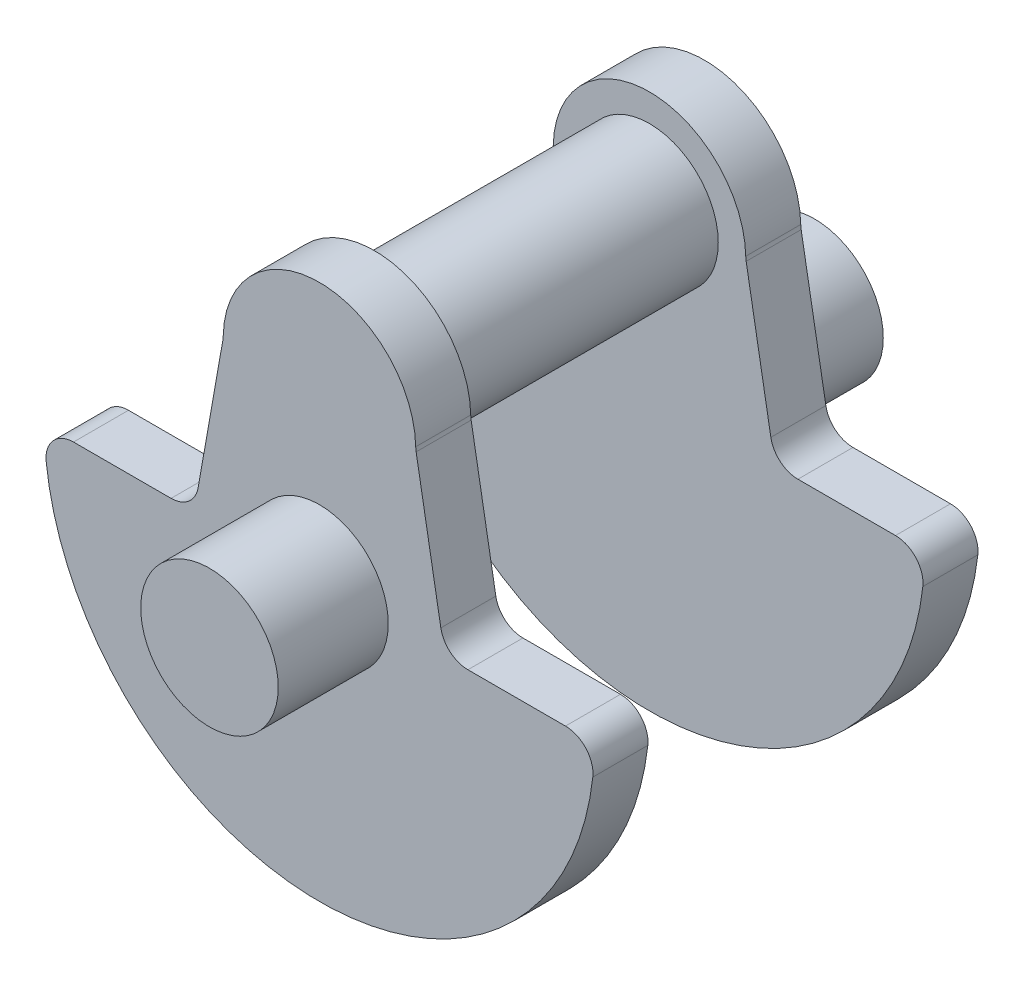
ISO-10303-21;
HEADER;
FILE_DESCRIPTION(('STEP AP214'),'2;1');
FILE_NAME('part.step','',(''),(''),'','','');
FILE_SCHEMA(('AUTOMOTIVE_DESIGN { 1 0 10303 214 1 1 1 1 }'));
ENDSEC;
DATA;
#1=APPLICATION_CONTEXT('core data for automotive mechanical design processes');
#2=APPLICATION_PROTOCOL_DEFINITION('international standard','automotive_design',2000,#1);
#3=PRODUCT_CONTEXT('',#1,'mechanical');
#4=PRODUCT('Part','Part','',(#3));
#5=PRODUCT_RELATED_PRODUCT_CATEGORY('part','',(#4));
#6=PRODUCT_DEFINITION_FORMATION('','',#4);
#7=PRODUCT_DEFINITION_CONTEXT('part definition',#1,'design');
#8=PRODUCT_DEFINITION('design','',#6,#7);
#9=PRODUCT_DEFINITION_SHAPE('','',#8);
#10=(LENGTH_UNIT() NAMED_UNIT(*) SI_UNIT(.MILLI.,.METRE.));
#11=(NAMED_UNIT(*) PLANE_ANGLE_UNIT() SI_UNIT($,.RADIAN.));
#12=(NAMED_UNIT(*) SI_UNIT($,.STERADIAN.) SOLID_ANGLE_UNIT());
#13=UNCERTAINTY_MEASURE_WITH_UNIT(LENGTH_MEASURE(1.E-05),#10,'distance_accuracy_value','');
#14=(GEOMETRIC_REPRESENTATION_CONTEXT(3) GLOBAL_UNCERTAINTY_ASSIGNED_CONTEXT((#13)) GLOBAL_UNIT_ASSIGNED_CONTEXT((#10,
#11,#12)) REPRESENTATION_CONTEXT('',''));
#15=CARTESIAN_POINT('',(0.,0.,0.));
#16=DIRECTION('',(0.,0.,1.));
#17=DIRECTION('',(1.,0.,0.));
#18=AXIS2_PLACEMENT_3D('',#15,#16,#17);
#19=CARTESIAN_POINT('',(0.,0.,-10.));
#20=DIRECTION('',(0.,0.,1.));
#21=DIRECTION('',(1.,0.,0.));
#22=AXIS2_PLACEMENT_3D('',#19,#20,#21);
#23=CYLINDRICAL_SURFACE('',#22,50.);
#24=CARTESIAN_POINT('',(0.,0.,-10.));
#25=DIRECTION('',(0.,0.,1.));
#26=DIRECTION('',(1.,0.,0.));
#27=AXIS2_PLACEMENT_3D('',#24,#25,#26);
#28=CIRCLE('',#27,50.);
#29=CARTESIAN_POINT('',(49.6903994999953,-5.55555555555556,-10.));
#30=VERTEX_POINT('',#29);
#31=CARTESIAN_POINT('',(-49.6903994999953,-5.55555555555556,-10.));
#32=VERTEX_POINT('',#31);
#33=EDGE_CURVE('E224',#30,#32,#28,.F.);
#34=ORIENTED_EDGE('',*,*,#33,.F.);
#35=DIRECTION('',(0.,0.,1.));
#36=VECTOR('',#35,1.);
#37=CARTESIAN_POINT('',(49.6903994999953,-5.55555555555556,-10.));
#38=LINE('',#37,#36);
#39=CARTESIAN_POINT('',(49.6903994999953,-5.55555555555556,0.));
#40=VERTEX_POINT('',#39);
#41=EDGE_CURVE('E208',#30,#40,#38,.T.);
#42=ORIENTED_EDGE('',*,*,#41,.T.);
#43=CARTESIAN_POINT('',(0.,0.,0.));
#44=DIRECTION('',(0.,0.,1.));
#45=DIRECTION('',(1.,0.,0.));
#46=AXIS2_PLACEMENT_3D('',#43,#44,#45);
#47=CIRCLE('',#46,50.);
#48=CARTESIAN_POINT('',(-49.6903994999953,-5.55555555555556,0.));
#49=VERTEX_POINT('',#48);
#50=EDGE_CURVE('E221',#40,#49,#47,.F.);
#51=ORIENTED_EDGE('',*,*,#50,.T.);
#52=DIRECTION('',(0.,0.,1.));
#53=VECTOR('',#52,1.);
#54=CARTESIAN_POINT('',(-49.6903994999953,-5.55555555555556,-10.));
#55=LINE('',#54,#53);
#56=EDGE_CURVE('E226',#49,#32,#55,.F.);
#57=ORIENTED_EDGE('',*,*,#56,.T.);
#58=EDGE_LOOP('',(#34,#42,#51,#57));
#59=FACE_BOUND('',#58,.T.);
#60=ADVANCED_FACE('F41',(#59),#23,.T.);
#61=CARTESIAN_POINT('',(0.,0.,-10.));
#62=DIRECTION('',(0.,1.,0.));
#63=DIRECTION('',(-1.,0.,0.));
#64=AXIS2_PLACEMENT_3D('',#61,#62,#63);
#65=PLANE('',#64);
#66=DIRECTION('',(-1.,0.,0.));
#67=VECTOR('',#66,1.);
#68=CARTESIAN_POINT('',(0.,0.,0.));
#69=LINE('',#68,#67);
#70=CARTESIAN_POINT('',(-26.98530757714,0.,0.));
#71=VERTEX_POINT('',#70);
#72=CARTESIAN_POINT('',(-44.7213595499958,0.,0.));
#73=VERTEX_POINT('',#72);
#74=EDGE_CURVE('E256',#71,#73,#69,.T.);
#75=ORIENTED_EDGE('',*,*,#74,.F.);
#76=DIRECTION('',(0.,0.,1.));
#77=VECTOR('',#76,1.);
#78=CARTESIAN_POINT('',(-26.98530757714,0.,-10.));
#79=LINE('',#78,#77);
#80=CARTESIAN_POINT('',(-26.98530757714,0.,-10.));
#81=VERTEX_POINT('',#80);
#82=EDGE_CURVE('E299',#71,#81,#79,.F.);
#83=ORIENTED_EDGE('',*,*,#82,.T.);
#84=DIRECTION('',(-1.,0.,0.));
#85=VECTOR('',#84,1.);
#86=CARTESIAN_POINT('',(0.,0.,-10.));
#87=LINE('',#86,#85);
#88=CARTESIAN_POINT('',(-44.7213595499958,0.,-10.));
#89=VERTEX_POINT('',#88);
#90=EDGE_CURVE('E242',#81,#89,#87,.T.);
#91=ORIENTED_EDGE('',*,*,#90,.T.);
#92=DIRECTION('',(0.,0.,-1.));
#93=VECTOR('',#92,1.);
#94=CARTESIAN_POINT('',(-44.7213595499958,0.,0.));
#95=LINE('',#94,#93);
#96=EDGE_CURVE('E295',#89,#73,#95,.F.);
#97=ORIENTED_EDGE('',*,*,#96,.T.);
#98=EDGE_LOOP('',(#75,#83,#91,#97));
#99=FACE_BOUND('',#98,.T.);
#100=ADVANCED_FACE('F494',(#99),#65,.T.);
#101=CARTESIAN_POINT('',(-22.1026125817614,3.89728694231062,-10.));
#102=DIRECTION('',(-0.98480775301221,0.173648177666917,0.));
#103=DIRECTION('',(-0.173648177666917,-0.98480775301221,0.));
#104=AXIS2_PLACEMENT_3D('',#101,#102,#103);
#105=PLANE('',#104);
#106=DIRECTION('',(-0.173648177666917,-0.98480775301221,0.));
#107=VECTOR('',#106,1.);
#108=CARTESIAN_POINT('',(-22.1026125817614,3.89728694231062,0.));
#109=LINE('',#108,#107);
#110=CARTESIAN_POINT('',(-17.5711628200528,29.5964155924017,0.));
#111=VERTEX_POINT('',#110);
#112=CARTESIAN_POINT('',(-22.0612688120789,4.13175911166541,0.));
#113=VERTEX_POINT('',#112);
#114=EDGE_CURVE('E252',#111,#113,#109,.T.);
#115=ORIENTED_EDGE('',*,*,#114,.F.);
#116=DIRECTION('',(0.,0.,-1.));
#117=VECTOR('',#116,1.);
#118=CARTESIAN_POINT('',(-17.5711628200528,29.5964155924017,-10.));
#119=LINE('',#118,#117);
#120=CARTESIAN_POINT('',(-17.5711628200528,29.5964155924017,-10.));
#121=VERTEX_POINT('',#120);
#122=EDGE_CURVE('E292',#111,#121,#119,.T.);
#123=ORIENTED_EDGE('',*,*,#122,.T.);
#124=DIRECTION('',(-0.173648177666917,-0.98480775301221,0.));
#125=VECTOR('',#124,1.);
#126=CARTESIAN_POINT('',(-22.1026125817614,3.89728694231062,-10.));
#127=LINE('',#126,#125);
#128=CARTESIAN_POINT('',(-22.0612688120789,4.13175911166541,-10.));
#129=VERTEX_POINT('',#128);
#130=EDGE_CURVE('E411',#121,#129,#127,.T.);
#131=ORIENTED_EDGE('',*,*,#130,.T.);
#132=DIRECTION('',(0.,0.,1.));
#133=VECTOR('',#132,1.);
#134=CARTESIAN_POINT('',(-22.0612688120789,4.13175911166541,0.));
#135=LINE('',#134,#133);
#136=EDGE_CURVE('E288',#129,#113,#135,.T.);
#137=ORIENTED_EDGE('',*,*,#136,.T.);
#138=EDGE_LOOP('',(#115,#123,#131,#137));
#139=FACE_BOUND('',#138,.T.);
#140=ADVANCED_FACE('F499',(#139),#105,.T.);
#141=CARTESIAN_POINT('',(0.,30.,-10.));
#142=DIRECTION('',(0.,0.,1.));
#143=DIRECTION('',(1.,0.,0.));
#144=AXIS2_PLACEMENT_3D('',#141,#142,#143);
#145=CYLINDRICAL_SURFACE('',#144,17.5);
#146=CARTESIAN_POINT('',(0.,30.,0.));
#147=DIRECTION('',(0.,0.,1.));
#148=DIRECTION('',(1.,0.,0.));
#149=AXIS2_PLACEMENT_3D('',#146,#147,#148);
#150=CIRCLE('',#149,17.5);
#151=CARTESIAN_POINT('',(17.496267899533,30.3613994850171,0.));
#152=VERTEX_POINT('',#151);
#153=CARTESIAN_POINT('',(-17.496267899533,30.3613994850171,0.));
#154=VERTEX_POINT('',#153);
#155=EDGE_CURVE('E248',#152,#154,#150,.T.);
#156=ORIENTED_EDGE('',*,*,#155,.F.);
#157=DIRECTION('',(0.,0.,1.));
#158=VECTOR('',#157,1.);
#159=CARTESIAN_POINT('',(17.496267899533,30.3613994850171,-10.));
#160=LINE('',#159,#158);
#161=CARTESIAN_POINT('',(17.496267899533,30.3613994850171,-10.));
#162=VERTEX_POINT('',#161);
#163=EDGE_CURVE('E285',#152,#162,#160,.F.);
#164=ORIENTED_EDGE('',*,*,#163,.T.);
#165=CARTESIAN_POINT('',(0.,30.,-10.));
#166=DIRECTION('',(0.,0.,1.));
#167=DIRECTION('',(1.,0.,0.));
#168=AXIS2_PLACEMENT_3D('',#165,#166,#167);
#169=CIRCLE('',#168,17.5);
#170=CARTESIAN_POINT('',(-17.496267899533,30.3613994850171,-10.));
#171=VERTEX_POINT('',#170);
#172=EDGE_CURVE('E414',#162,#171,#169,.T.);
#173=ORIENTED_EDGE('',*,*,#172,.T.);
#174=DIRECTION('',(0.,0.,1.));
#175=VECTOR('',#174,1.);
#176=CARTESIAN_POINT('',(-17.496267899533,30.3613994850171,-10.));
#177=LINE('',#176,#175);
#178=EDGE_CURVE('E281',#171,#154,#177,.T.);
#179=ORIENTED_EDGE('',*,*,#178,.T.);
#180=EDGE_LOOP('',(#156,#164,#173,#179));
#181=FACE_BOUND('',#180,.T.);
#182=ADVANCED_FACE('F624',(#181),#145,.T.);
#183=CARTESIAN_POINT('',(22.1026125817614,3.89728694231062,-10.));
#184=DIRECTION('',(-0.98480775301221,-0.173648177666917,0.));
#185=DIRECTION('',(0.173648177666917,-0.98480775301221,0.));
#186=AXIS2_PLACEMENT_3D('',#183,#184,#185);
#187=PLANE('',#186);
#188=DIRECTION('',(0.173648177666917,-0.98480775301221,0.));
#189=VECTOR('',#188,1.);
#190=CARTESIAN_POINT('',(22.1026125817614,3.89728694231062,0.));
#191=LINE('',#190,#189);
#192=CARTESIAN_POINT('',(17.5711628200528,29.5964155924017,0.));
#193=VERTEX_POINT('',#192);
#194=CARTESIAN_POINT('',(22.0612688120789,4.13175911166541,0.));
#195=VERTEX_POINT('',#194);
#196=EDGE_CURVE('E236',#193,#195,#191,.T.);
#197=ORIENTED_EDGE('',*,*,#196,.T.);
#198=DIRECTION('',(0.,0.,1.));
#199=VECTOR('',#198,1.);
#200=CARTESIAN_POINT('',(22.0612688120789,4.13175911166541,-10.));
#201=LINE('',#200,#199);
#202=CARTESIAN_POINT('',(22.0612688120789,4.13175911166541,-10.));
#203=VERTEX_POINT('',#202);
#204=EDGE_CURVE('E278',#195,#203,#201,.F.);
#205=ORIENTED_EDGE('',*,*,#204,.T.);
#206=DIRECTION('',(0.173648177666917,-0.98480775301221,0.));
#207=VECTOR('',#206,1.);
#208=CARTESIAN_POINT('',(22.1026125817614,3.89728694231062,-10.));
#209=LINE('',#208,#207);
#210=CARTESIAN_POINT('',(17.5711628200528,29.5964155924017,-10.));
#211=VERTEX_POINT('',#210);
#212=EDGE_CURVE('E417',#211,#203,#209,.T.);
#213=ORIENTED_EDGE('',*,*,#212,.F.);
#214=DIRECTION('',(0.,0.,1.));
#215=VECTOR('',#214,1.);
#216=CARTESIAN_POINT('',(17.5711628200528,29.5964155924017,-10.));
#217=LINE('',#216,#215);
#218=EDGE_CURVE('E274',#211,#193,#217,.T.);
#219=ORIENTED_EDGE('',*,*,#218,.T.);
#220=EDGE_LOOP('',(#197,#205,#213,#219));
#221=FACE_BOUND('',#220,.T.);
#222=ADVANCED_FACE('F627',(#221),#187,.F.);
#223=CARTESIAN_POINT('',(0.,0.,-10.));
#224=DIRECTION('',(0.,-1.,0.));
#225=DIRECTION('',(1.,0.,0.));
#226=AXIS2_PLACEMENT_3D('',#223,#224,#225);
#227=PLANE('',#226);
#228=DIRECTION('',(1.,0.,0.));
#229=VECTOR('',#228,1.);
#230=CARTESIAN_POINT('',(0.,0.,0.));
#231=LINE('',#230,#229);
#232=CARTESIAN_POINT('',(26.98530757714,0.,0.));
#233=VERTEX_POINT('',#232);
#234=CARTESIAN_POINT('',(44.7213595499958,0.,0.));
#235=VERTEX_POINT('',#234);
#236=EDGE_CURVE('E231',#233,#235,#231,.T.);
#237=ORIENTED_EDGE('',*,*,#236,.T.);
#238=DIRECTION('',(0.,0.,1.));
#239=VECTOR('',#238,1.);
#240=CARTESIAN_POINT('',(44.7213595499958,0.,-10.));
#241=LINE('',#240,#239);
#242=CARTESIAN_POINT('',(44.7213595499958,0.,-10.));
#243=VERTEX_POINT('',#242);
#244=EDGE_CURVE('E209',#235,#243,#241,.F.);
#245=ORIENTED_EDGE('',*,*,#244,.T.);
#246=DIRECTION('',(1.,0.,0.));
#247=VECTOR('',#246,1.);
#248=CARTESIAN_POINT('',(0.,0.,-10.));
#249=LINE('',#248,#247);
#250=CARTESIAN_POINT('',(26.98530757714,0.,-10.));
#251=VERTEX_POINT('',#250);
#252=EDGE_CURVE('E421',#251,#243,#249,.T.);
#253=ORIENTED_EDGE('',*,*,#252,.F.);
#254=DIRECTION('',(0.,0.,1.));
#255=VECTOR('',#254,1.);
#256=CARTESIAN_POINT('',(26.98530757714,0.,0.));
#257=LINE('',#256,#255);
#258=EDGE_CURVE('E215',#251,#233,#257,.T.);
#259=ORIENTED_EDGE('',*,*,#258,.T.);
#260=EDGE_LOOP('',(#237,#245,#253,#259));
#261=FACE_BOUND('',#260,.T.);
#262=ADVANCED_FACE('F504',(#261),#227,.F.);
#263=CARTESIAN_POINT('',(0.,0.,-10.));
#264=DIRECTION('',(0.,0.,1.));
#265=DIRECTION('',(1.,0.,0.));
#266=AXIS2_PLACEMENT_3D('',#263,#264,#265);
#267=PLANE('',#266);
#268=CARTESIAN_POINT('',(0.,30.,-10.));
#269=DIRECTION('',(0.,0.,1.));
#270=DIRECTION('',(1.,0.,0.));
#271=AXIS2_PLACEMENT_3D('',#268,#269,#270);
#272=CIRCLE('',#271,12.5);
#273=CARTESIAN_POINT('',(12.5,30.,-10.));
#274=VERTEX_POINT('',#273);
#275=EDGE_CURVE('E327',#274,#274,#272,.F.);
#276=ORIENTED_EDGE('',*,*,#275,.F.);
#277=EDGE_LOOP('',(#276));
#278=FACE_BOUND('',#277,.T.);
#279=ORIENTED_EDGE('',*,*,#252,.T.);
#280=CARTESIAN_POINT('',(44.7213595499958,-5.00000000000001,-10.));
#281=DIRECTION('',(0.,0.,1.));
#282=DIRECTION('',(1.,0.,0.));
#283=AXIS2_PLACEMENT_3D('',#280,#281,#282);
#284=CIRCLE('',#283,5.);
#285=EDGE_CURVE('E271',#243,#30,#284,.F.);
#286=ORIENTED_EDGE('',*,*,#285,.T.);
#287=ORIENTED_EDGE('',*,*,#33,.T.);
#288=CARTESIAN_POINT('',(-44.7213595499958,-5.00000000000001,-10.));
#289=DIRECTION('',(0.,0.,1.));
#290=DIRECTION('',(1.,0.,0.));
#291=AXIS2_PLACEMENT_3D('',#288,#289,#290);
#292=CIRCLE('',#291,5.);
#293=EDGE_CURVE('E268',#32,#89,#292,.F.);
#294=ORIENTED_EDGE('',*,*,#293,.T.);
#295=ORIENTED_EDGE('',*,*,#90,.F.);
#296=CARTESIAN_POINT('',(-26.98530757714,5.,-10.));
#297=DIRECTION('',(0.,0.,1.));
#298=DIRECTION('',(1.,0.,0.));
#299=AXIS2_PLACEMENT_3D('',#296,#297,#298);
#300=CIRCLE('',#299,5.);
#301=EDGE_CURVE('E323',#81,#129,#300,.T.);
#302=ORIENTED_EDGE('',*,*,#301,.T.);
#303=ORIENTED_EDGE('',*,*,#130,.F.);
#304=CARTESIAN_POINT('',(-22.4952015851139,30.4646564807363,-10.));
#305=DIRECTION('',(0.,0.,1.));
#306=DIRECTION('',(1.,0.,0.));
#307=AXIS2_PLACEMENT_3D('',#304,#305,#306);
#308=CIRCLE('',#307,5.);
#309=EDGE_CURVE('E317',#121,#171,#308,.T.);
#310=ORIENTED_EDGE('',*,*,#309,.T.);
#311=ORIENTED_EDGE('',*,*,#172,.F.);
#312=CARTESIAN_POINT('',(22.4952015851139,30.4646564807363,-10.));
#313=DIRECTION('',(0.,0.,1.));
#314=DIRECTION('',(1.,0.,0.));
#315=AXIS2_PLACEMENT_3D('',#312,#313,#314);
#316=CIRCLE('',#315,5.);
#317=EDGE_CURVE('E311',#162,#211,#316,.T.);
#318=ORIENTED_EDGE('',*,*,#317,.T.);
#319=ORIENTED_EDGE('',*,*,#212,.T.);
#320=CARTESIAN_POINT('',(26.98530757714,5.,-10.));
#321=DIRECTION('',(0.,0.,1.));
#322=DIRECTION('',(1.,0.,0.));
#323=AXIS2_PLACEMENT_3D('',#320,#321,#322);
#324=CIRCLE('',#323,5.);
#325=EDGE_CURVE('E305',#203,#251,#324,.T.);
#326=ORIENTED_EDGE('',*,*,#325,.T.);
#327=EDGE_LOOP('',(#279,#286,#287,#294,#295,#302,#303,#310,#311,#318,#319,#326));
#328=FACE_BOUND('',#327,.T.);
#329=ADVANCED_FACE('F615',(#278,#328),#267,.F.);
#330=CARTESIAN_POINT('',(0.,0.,0.));
#331=DIRECTION('',(0.,0.,1.));
#332=DIRECTION('',(1.,0.,0.));
#333=AXIS2_PLACEMENT_3D('',#330,#331,#332);
#334=PLANE('',#333);
#335=CARTESIAN_POINT('',(0.,0.,0.));
#336=DIRECTION('',(0.,0.,1.));
#337=DIRECTION('',(1.,0.,0.));
#338=AXIS2_PLACEMENT_3D('',#335,#336,#337);
#339=CIRCLE('',#338,12.5);
#340=CARTESIAN_POINT('',(12.5,0.,0.));
#341=VERTEX_POINT('',#340);
#342=EDGE_CURVE('E326',#341,#341,#339,.T.);
#343=ORIENTED_EDGE('',*,*,#342,.F.);
#344=EDGE_LOOP('',(#343));
#345=FACE_BOUND('',#344,.T.);
#346=ORIENTED_EDGE('',*,*,#50,.F.);
#347=CARTESIAN_POINT('',(44.7213595499958,-5.00000000000001,0.));
#348=DIRECTION('',(0.,0.,1.));
#349=DIRECTION('',(1.,0.,0.));
#350=AXIS2_PLACEMENT_3D('',#347,#348,#349);
#351=CIRCLE('',#350,5.);
#352=EDGE_CURVE('E204',#40,#235,#351,.T.);
#353=ORIENTED_EDGE('',*,*,#352,.T.);
#354=ORIENTED_EDGE('',*,*,#236,.F.);
#355=CARTESIAN_POINT('',(26.98530757714,5.,0.));
#356=DIRECTION('',(0.,0.,1.));
#357=DIRECTION('',(1.,0.,0.));
#358=AXIS2_PLACEMENT_3D('',#355,#356,#357);
#359=CIRCLE('',#358,5.);
#360=EDGE_CURVE('E302',#233,#195,#359,.F.);
#361=ORIENTED_EDGE('',*,*,#360,.T.);
#362=ORIENTED_EDGE('',*,*,#196,.F.);
#363=CARTESIAN_POINT('',(22.4952015851139,30.4646564807363,0.));
#364=DIRECTION('',(0.,0.,1.));
#365=DIRECTION('',(1.,0.,0.));
#366=AXIS2_PLACEMENT_3D('',#363,#364,#365);
#367=CIRCLE('',#366,5.);
#368=EDGE_CURVE('E308',#193,#152,#367,.F.);
#369=ORIENTED_EDGE('',*,*,#368,.T.);
#370=ORIENTED_EDGE('',*,*,#155,.T.);
#371=CARTESIAN_POINT('',(-22.4952015851139,30.4646564807363,0.));
#372=DIRECTION('',(0.,0.,1.));
#373=DIRECTION('',(1.,0.,0.));
#374=AXIS2_PLACEMENT_3D('',#371,#372,#373);
#375=CIRCLE('',#374,5.);
#376=EDGE_CURVE('E314',#154,#111,#375,.F.);
#377=ORIENTED_EDGE('',*,*,#376,.T.);
#378=ORIENTED_EDGE('',*,*,#114,.T.);
#379=CARTESIAN_POINT('',(-26.98530757714,5.,0.));
#380=DIRECTION('',(0.,0.,1.));
#381=DIRECTION('',(1.,0.,0.));
#382=AXIS2_PLACEMENT_3D('',#379,#380,#381);
#383=CIRCLE('',#382,5.);
#384=EDGE_CURVE('E320',#113,#71,#383,.F.);
#385=ORIENTED_EDGE('',*,*,#384,.T.);
#386=ORIENTED_EDGE('',*,*,#74,.T.);
#387=CARTESIAN_POINT('',(-44.7213595499958,-5.00000000000001,0.));
#388=DIRECTION('',(0.,0.,1.));
#389=DIRECTION('',(1.,0.,0.));
#390=AXIS2_PLACEMENT_3D('',#387,#388,#389);
#391=CIRCLE('',#390,5.);
#392=EDGE_CURVE('E216',#73,#49,#391,.T.);
#393=ORIENTED_EDGE('',*,*,#392,.T.);
#394=EDGE_LOOP('',(#346,#353,#354,#361,#362,#369,#370,#377,#378,#385,#386,#393));
#395=FACE_BOUND('',#394,.T.);
#396=ADVANCED_FACE('F228',(#345,#395),#334,.T.);
#397=CARTESIAN_POINT('',(44.7213595499958,-5.00000000000001,-10.));
#398=DIRECTION('',(0.,0.,1.));
#399=DIRECTION('',(1.,0.,0.));
#400=AXIS2_PLACEMENT_3D('',#397,#398,#399);
#401=CYLINDRICAL_SURFACE('',#400,5.);
#402=ORIENTED_EDGE('',*,*,#285,.F.);
#403=ORIENTED_EDGE('',*,*,#244,.F.);
#404=ORIENTED_EDGE('',*,*,#352,.F.);
#405=ORIENTED_EDGE('',*,*,#41,.F.);
#406=EDGE_LOOP('',(#402,#403,#404,#405));
#407=FACE_BOUND('',#406,.T.);
#408=ADVANCED_FACE('F207',(#407),#401,.T.);
#409=CARTESIAN_POINT('',(26.98530757714,5.,-10.));
#410=DIRECTION('',(0.,0.,-1.));
#411=DIRECTION('',(-1.,0.,0.));
#412=AXIS2_PLACEMENT_3D('',#409,#410,#411);
#413=CYLINDRICAL_SURFACE('',#412,5.);
#414=ORIENTED_EDGE('',*,*,#325,.F.);
#415=ORIENTED_EDGE('',*,*,#204,.F.);
#416=ORIENTED_EDGE('',*,*,#360,.F.);
#417=ORIENTED_EDGE('',*,*,#258,.F.);
#418=EDGE_LOOP('',(#414,#415,#416,#417));
#419=FACE_BOUND('',#418,.T.);
#420=ADVANCED_FACE('F508',(#419),#413,.F.);
#421=CARTESIAN_POINT('',(22.4952015851139,30.4646564807363,-10.));
#422=DIRECTION('',(0.,0.,1.));
#423=DIRECTION('',(1.,0.,0.));
#424=AXIS2_PLACEMENT_3D('',#421,#422,#423);
#425=CYLINDRICAL_SURFACE('',#424,5.);
#426=ORIENTED_EDGE('',*,*,#317,.F.);
#427=ORIENTED_EDGE('',*,*,#163,.F.);
#428=ORIENTED_EDGE('',*,*,#368,.F.);
#429=ORIENTED_EDGE('',*,*,#218,.F.);
#430=EDGE_LOOP('',(#426,#427,#428,#429));
#431=FACE_BOUND('',#430,.T.);
#432=ADVANCED_FACE('F511',(#431),#425,.F.);
#433=CARTESIAN_POINT('',(-22.4952015851139,30.4646564807363,-10.));
#434=DIRECTION('',(0.,0.,1.));
#435=DIRECTION('',(1.,0.,0.));
#436=AXIS2_PLACEMENT_3D('',#433,#434,#435);
#437=CYLINDRICAL_SURFACE('',#436,5.);
#438=ORIENTED_EDGE('',*,*,#309,.F.);
#439=ORIENTED_EDGE('',*,*,#122,.F.);
#440=ORIENTED_EDGE('',*,*,#376,.F.);
#441=ORIENTED_EDGE('',*,*,#178,.F.);
#442=EDGE_LOOP('',(#438,#439,#440,#441));
#443=FACE_BOUND('',#442,.T.);
#444=ADVANCED_FACE('F515',(#443),#437,.F.);
#445=CARTESIAN_POINT('',(-26.98530757714,5.,-10.));
#446=DIRECTION('',(0.,0.,-1.));
#447=DIRECTION('',(-1.,0.,0.));
#448=AXIS2_PLACEMENT_3D('',#445,#446,#447);
#449=CYLINDRICAL_SURFACE('',#448,5.);
#450=ORIENTED_EDGE('',*,*,#301,.F.);
#451=ORIENTED_EDGE('',*,*,#82,.F.);
#452=ORIENTED_EDGE('',*,*,#384,.F.);
#453=ORIENTED_EDGE('',*,*,#136,.F.);
#454=EDGE_LOOP('',(#450,#451,#452,#453));
#455=FACE_BOUND('',#454,.T.);
#456=ADVANCED_FACE('F519',(#455),#449,.F.);
#457=CARTESIAN_POINT('',(-44.7213595499958,-5.00000000000001,-10.));
#458=DIRECTION('',(0.,0.,1.));
#459=DIRECTION('',(1.,0.,0.));
#460=AXIS2_PLACEMENT_3D('',#457,#458,#459);
#461=CYLINDRICAL_SURFACE('',#460,5.);
#462=ORIENTED_EDGE('',*,*,#293,.F.);
#463=ORIENTED_EDGE('',*,*,#56,.F.);
#464=ORIENTED_EDGE('',*,*,#392,.F.);
#465=ORIENTED_EDGE('',*,*,#96,.F.);
#466=EDGE_LOOP('',(#462,#463,#464,#465));
#467=FACE_BOUND('',#466,.T.);
#468=ADVANCED_FACE('F523',(#467),#461,.T.);
#469=CARTESIAN_POINT('',(0.,0.,20.));
#470=DIRECTION('',(0.,0.,-1.));
#471=DIRECTION('',(-1.,0.,0.));
#472=AXIS2_PLACEMENT_3D('',#469,#470,#471);
#473=CYLINDRICAL_SURFACE('',#472,12.5);
#474=CARTESIAN_POINT('',(0.,0.,20.));
#475=DIRECTION('',(0.,0.,1.));
#476=DIRECTION('',(1.,0.,0.));
#477=AXIS2_PLACEMENT_3D('',#474,#475,#476);
#478=CIRCLE('',#477,12.5);
#479=CARTESIAN_POINT('',(12.5,0.,20.));
#480=VERTEX_POINT('',#479);
#481=EDGE_CURVE('E232',#480,#480,#478,.T.);
#482=ORIENTED_EDGE('',*,*,#481,.F.);
#483=EDGE_LOOP('',(#482));
#484=FACE_BOUND('',#483,.T.);
#485=ORIENTED_EDGE('',*,*,#342,.T.);
#486=EDGE_LOOP('',(#485));
#487=FACE_BOUND('',#486,.T.);
#488=ADVANCED_FACE('F527',(#484,#487),#473,.T.);
#489=CARTESIAN_POINT('',(0.,0.,20.));
#490=DIRECTION('',(0.,0.,1.));
#491=DIRECTION('',(1.,0.,0.));
#492=AXIS2_PLACEMENT_3D('',#489,#490,#491);
#493=PLANE('',#492);
#494=ORIENTED_EDGE('',*,*,#481,.T.);
#495=EDGE_LOOP('',(#494));
#496=FACE_BOUND('',#495,.T.);
#497=ADVANCED_FACE('F607',(#496),#493,.T.);
#498=CARTESIAN_POINT('',(0.,30.,-60.));
#499=DIRECTION('',(0.,0.,1.));
#500=DIRECTION('',(1.,0.,0.));
#501=AXIS2_PLACEMENT_3D('',#498,#499,#500);
#502=CYLINDRICAL_SURFACE('',#501,12.5);
#503=CARTESIAN_POINT('',(0.,30.,-60.));
#504=DIRECTION('',(0.,0.,-1.));
#505=DIRECTION('',(-1.,0.,0.));
#506=AXIS2_PLACEMENT_3D('',#503,#504,#505);
#507=CIRCLE('',#506,12.5);
#508=CARTESIAN_POINT('',(-12.5,30.,-60.));
#509=VERTEX_POINT('',#508);
#510=EDGE_CURVE('E239',#509,#509,#507,.T.);
#511=ORIENTED_EDGE('',*,*,#510,.F.);
#512=EDGE_LOOP('',(#511));
#513=FACE_BOUND('',#512,.T.);
#514=ORIENTED_EDGE('',*,*,#275,.T.);
#515=EDGE_LOOP('',(#514));
#516=FACE_BOUND('',#515,.T.);
#517=ADVANCED_FACE('F604',(#513,#516),#502,.T.);
#518=CARTESIAN_POINT('',(0.,0.,-60.));
#519=DIRECTION('',(0.,0.,-1.));
#520=DIRECTION('',(-1.,0.,0.));
#521=AXIS2_PLACEMENT_3D('',#518,#519,#520);
#522=CYLINDRICAL_SURFACE('',#521,50.);
#523=CARTESIAN_POINT('',(0.,0.,-70.));
#524=DIRECTION('',(0.,0.,1.));
#525=DIRECTION('',(1.,0.,0.));
#526=AXIS2_PLACEMENT_3D('',#523,#524,#525);
#527=CIRCLE('',#526,50.);
#528=CARTESIAN_POINT('',(49.6903994999953,-5.55555555555556,-70.));
#529=VERTEX_POINT('',#528);
#530=CARTESIAN_POINT('',(-49.6903994999953,-5.55555555555556,-70.));
#531=VERTEX_POINT('',#530);
#532=EDGE_CURVE('E454',#529,#531,#527,.F.);
#533=ORIENTED_EDGE('',*,*,#532,.F.);
#534=DIRECTION('',(0.,0.,-1.));
#535=VECTOR('',#534,1.);
#536=CARTESIAN_POINT('',(49.6903994999953,-5.55555555555556,-60.));
#537=LINE('',#536,#535);
#538=CARTESIAN_POINT('',(49.6903994999953,-5.55555555555556,-60.));
#539=VERTEX_POINT('',#538);
#540=EDGE_CURVE('E348',#529,#539,#537,.F.);
#541=ORIENTED_EDGE('',*,*,#540,.T.);
#542=CARTESIAN_POINT('',(0.,0.,-60.));
#543=DIRECTION('',(0.,0.,1.));
#544=DIRECTION('',(1.,0.,0.));
#545=AXIS2_PLACEMENT_3D('',#542,#543,#544);
#546=CIRCLE('',#545,50.);
#547=CARTESIAN_POINT('',(-49.6903994999953,-5.55555555555556,-60.));
#548=VERTEX_POINT('',#547);
#549=EDGE_CURVE('E438',#539,#548,#546,.F.);
#550=ORIENTED_EDGE('',*,*,#549,.T.);
#551=DIRECTION('',(0.,0.,-1.));
#552=VECTOR('',#551,1.);
#553=CARTESIAN_POINT('',(-49.6903994999953,-5.55555555555556,-60.));
#554=LINE('',#553,#552);
#555=EDGE_CURVE('E344',#548,#531,#554,.T.);
#556=ORIENTED_EDGE('',*,*,#555,.T.);
#557=EDGE_LOOP('',(#533,#541,#550,#556));
#558=FACE_BOUND('',#557,.T.);
#559=ADVANCED_FACE('F562',(#558),#522,.T.);
#560=CARTESIAN_POINT('',(0.,0.,-60.));
#561=DIRECTION('',(0.,1.,0.));
#562=DIRECTION('',(-1.,0.,0.));
#563=AXIS2_PLACEMENT_3D('',#560,#561,#562);
#564=PLANE('',#563);
#565=DIRECTION('',(1.,0.,0.));
#566=VECTOR('',#565,1.);
#567=CARTESIAN_POINT('',(0.,0.,-60.));
#568=LINE('',#567,#566);
#569=CARTESIAN_POINT('',(26.98530757714,0.,-60.));
#570=VERTEX_POINT('',#569);
#571=CARTESIAN_POINT('',(44.7213595499958,0.,-60.));
#572=VERTEX_POINT('',#571);
#573=EDGE_CURVE('E433',#570,#572,#568,.T.);
#574=ORIENTED_EDGE('',*,*,#573,.T.);
#575=DIRECTION('',(0.,0.,-1.));
#576=VECTOR('',#575,1.);
#577=CARTESIAN_POINT('',(44.7213595499958,0.,-60.));
#578=LINE('',#577,#576);
#579=CARTESIAN_POINT('',(44.7213595499958,0.,-70.));
#580=VERTEX_POINT('',#579);
#581=EDGE_CURVE('E334',#572,#580,#578,.T.);
#582=ORIENTED_EDGE('',*,*,#581,.T.);
#583=DIRECTION('',(1.,0.,0.));
#584=VECTOR('',#583,1.);
#585=CARTESIAN_POINT('',(0.,0.,-70.));
#586=LINE('',#585,#584);
#587=CARTESIAN_POINT('',(26.98530757714,0.,-70.));
#588=VERTEX_POINT('',#587);
#589=EDGE_CURVE('E434',#588,#580,#586,.T.);
#590=ORIENTED_EDGE('',*,*,#589,.F.);
#591=DIRECTION('',(0.,0.,-1.));
#592=VECTOR('',#591,1.);
#593=CARTESIAN_POINT('',(26.98530757714,0.,-60.));
#594=LINE('',#593,#592);
#595=EDGE_CURVE('E331',#588,#570,#594,.F.);
#596=ORIENTED_EDGE('',*,*,#595,.T.);
#597=EDGE_LOOP('',(#574,#582,#590,#596));
#598=FACE_BOUND('',#597,.T.);
#599=ADVANCED_FACE('F571',(#598),#564,.T.);
#600=CARTESIAN_POINT('',(22.1026125817614,3.89728694231062,-60.));
#601=DIRECTION('',(0.98480775301221,0.173648177666917,0.));
#602=DIRECTION('',(-0.173648177666917,0.98480775301221,0.));
#603=AXIS2_PLACEMENT_3D('',#600,#601,#602);
#604=PLANE('',#603);
#605=DIRECTION('',(0.173648177666917,-0.98480775301221,0.));
#606=VECTOR('',#605,1.);
#607=CARTESIAN_POINT('',(22.1026125817614,3.89728694231062,-60.));
#608=LINE('',#607,#606);
#609=CARTESIAN_POINT('',(17.5711628200528,29.5964155924017,-60.));
#610=VERTEX_POINT('',#609);
#611=CARTESIAN_POINT('',(22.0612688120789,4.13175911166541,-60.));
#612=VERTEX_POINT('',#611);
#613=EDGE_CURVE('E462',#610,#612,#608,.T.);
#614=ORIENTED_EDGE('',*,*,#613,.T.);
#615=DIRECTION('',(0.,0.,-1.));
#616=VECTOR('',#615,1.);
#617=CARTESIAN_POINT('',(22.0612688120789,4.13175911166541,-70.));
#618=LINE('',#617,#616);
#619=CARTESIAN_POINT('',(22.0612688120789,4.13175911166541,-70.));
#620=VERTEX_POINT('',#619);
#621=EDGE_CURVE('E360',#612,#620,#618,.T.);
#622=ORIENTED_EDGE('',*,*,#621,.T.);
#623=DIRECTION('',(0.173648177666917,-0.98480775301221,0.));
#624=VECTOR('',#623,1.);
#625=CARTESIAN_POINT('',(22.1026125817614,3.89728694231062,-70.));
#626=LINE('',#625,#624);
#627=CARTESIAN_POINT('',(17.5711628200528,29.5964155924017,-70.));
#628=VERTEX_POINT('',#627);
#629=EDGE_CURVE('E439',#628,#620,#626,.T.);
#630=ORIENTED_EDGE('',*,*,#629,.F.);
#631=DIRECTION('',(0.,0.,-1.));
#632=VECTOR('',#631,1.);
#633=CARTESIAN_POINT('',(17.5711628200528,29.5964155924017,-60.));
#634=LINE('',#633,#632);
#635=EDGE_CURVE('E357',#628,#610,#634,.F.);
#636=ORIENTED_EDGE('',*,*,#635,.T.);
#637=EDGE_LOOP('',(#614,#622,#630,#636));
#638=FACE_BOUND('',#637,.T.);
#639=ADVANCED_FACE('F577',(#638),#604,.T.);
#640=CARTESIAN_POINT('',(0.,30.,-60.));
#641=DIRECTION('',(0.,0.,-1.));
#642=DIRECTION('',(-1.,0.,0.));
#643=AXIS2_PLACEMENT_3D('',#640,#641,#642);
#644=CYLINDRICAL_SURFACE('',#643,17.5);
#645=CARTESIAN_POINT('',(0.,30.,-60.));
#646=DIRECTION('',(0.,0.,1.));
#647=DIRECTION('',(1.,0.,0.));
#648=AXIS2_PLACEMENT_3D('',#645,#646,#647);
#649=CIRCLE('',#648,17.5);
#650=CARTESIAN_POINT('',(17.496267899533,30.3613994850171,-60.));
#651=VERTEX_POINT('',#650);
#652=CARTESIAN_POINT('',(-17.496267899533,30.3613994850171,-60.));
#653=VERTEX_POINT('',#652);
#654=EDGE_CURVE('E466',#651,#653,#649,.T.);
#655=ORIENTED_EDGE('',*,*,#654,.F.);
#656=DIRECTION('',(0.,0.,-1.));
#657=VECTOR('',#656,1.);
#658=CARTESIAN_POINT('',(17.496267899533,30.3613994850171,-60.));
#659=LINE('',#658,#657);
#660=CARTESIAN_POINT('',(17.496267899533,30.3613994850171,-70.));
#661=VERTEX_POINT('',#660);
#662=EDGE_CURVE('E367',#651,#661,#659,.T.);
#663=ORIENTED_EDGE('',*,*,#662,.T.);
#664=CARTESIAN_POINT('',(0.,30.,-70.));
#665=DIRECTION('',(0.,0.,1.));
#666=DIRECTION('',(1.,0.,0.));
#667=AXIS2_PLACEMENT_3D('',#664,#665,#666);
#668=CIRCLE('',#667,17.5);
#669=CARTESIAN_POINT('',(-17.496267899533,30.3613994850171,-70.));
#670=VERTEX_POINT('',#669);
#671=EDGE_CURVE('E443',#661,#670,#668,.T.);
#672=ORIENTED_EDGE('',*,*,#671,.T.);
#673=DIRECTION('',(0.,0.,-1.));
#674=VECTOR('',#673,1.);
#675=CARTESIAN_POINT('',(-17.496267899533,30.3613994850171,-60.));
#676=LINE('',#675,#674);
#677=EDGE_CURVE('E364',#670,#653,#676,.F.);
#678=ORIENTED_EDGE('',*,*,#677,.T.);
#679=EDGE_LOOP('',(#655,#663,#672,#678));
#680=FACE_BOUND('',#679,.T.);
#681=ADVANCED_FACE('F585',(#680),#644,.T.);
#682=CARTESIAN_POINT('',(-22.1026125817614,3.89728694231062,-60.));
#683=DIRECTION('',(0.98480775301221,-0.173648177666917,0.));
#684=DIRECTION('',(0.173648177666917,0.98480775301221,0.));
#685=AXIS2_PLACEMENT_3D('',#682,#683,#684);
#686=PLANE('',#685);
#687=DIRECTION('',(-0.173648177666917,-0.98480775301221,0.));
#688=VECTOR('',#687,1.);
#689=CARTESIAN_POINT('',(-22.1026125817614,3.89728694231062,-60.));
#690=LINE('',#689,#688);
#691=CARTESIAN_POINT('',(-17.5711628200528,29.5964155924017,-60.));
#692=VERTEX_POINT('',#691);
#693=CARTESIAN_POINT('',(-22.0612688120789,4.13175911166541,-60.));
#694=VERTEX_POINT('',#693);
#695=EDGE_CURVE('E470',#692,#694,#690,.T.);
#696=ORIENTED_EDGE('',*,*,#695,.F.);
#697=DIRECTION('',(0.,0.,1.));
#698=VECTOR('',#697,1.);
#699=CARTESIAN_POINT('',(-17.5711628200528,29.5964155924017,-70.));
#700=LINE('',#699,#698);
#701=CARTESIAN_POINT('',(-17.5711628200528,29.5964155924017,-70.));
#702=VERTEX_POINT('',#701);
#703=EDGE_CURVE('E374',#692,#702,#700,.F.);
#704=ORIENTED_EDGE('',*,*,#703,.T.);
#705=DIRECTION('',(-0.173648177666917,-0.98480775301221,0.));
#706=VECTOR('',#705,1.);
#707=CARTESIAN_POINT('',(-22.1026125817614,3.89728694231062,-70.));
#708=LINE('',#707,#706);
#709=CARTESIAN_POINT('',(-22.0612688120789,4.13175911166541,-70.));
#710=VERTEX_POINT('',#709);
#711=EDGE_CURVE('E447',#702,#710,#708,.T.);
#712=ORIENTED_EDGE('',*,*,#711,.T.);
#713=DIRECTION('',(0.,0.,-1.));
#714=VECTOR('',#713,1.);
#715=CARTESIAN_POINT('',(-22.0612688120789,4.13175911166541,-60.));
#716=LINE('',#715,#714);
#717=EDGE_CURVE('E371',#710,#694,#716,.F.);
#718=ORIENTED_EDGE('',*,*,#717,.T.);
#719=EDGE_LOOP('',(#696,#704,#712,#718));
#720=FACE_BOUND('',#719,.T.);
#721=ADVANCED_FACE('F591',(#720),#686,.F.);
#722=CARTESIAN_POINT('',(0.,0.,-60.));
#723=DIRECTION('',(0.,-1.,0.));
#724=DIRECTION('',(1.,0.,0.));
#725=AXIS2_PLACEMENT_3D('',#722,#723,#724);
#726=PLANE('',#725);
#727=DIRECTION('',(-1.,0.,0.));
#728=VECTOR('',#727,1.);
#729=CARTESIAN_POINT('',(0.,0.,-60.));
#730=LINE('',#729,#728);
#731=CARTESIAN_POINT('',(-26.98530757714,0.,-60.));
#732=VERTEX_POINT('',#731);
#733=CARTESIAN_POINT('',(-44.7213595499958,0.,-60.));
#734=VERTEX_POINT('',#733);
#735=EDGE_CURVE('E473',#732,#734,#730,.T.);
#736=ORIENTED_EDGE('',*,*,#735,.F.);
#737=DIRECTION('',(0.,0.,-1.));
#738=VECTOR('',#737,1.);
#739=CARTESIAN_POINT('',(-26.98530757714,0.,-70.));
#740=LINE('',#739,#738);
#741=CARTESIAN_POINT('',(-26.98530757714,0.,-70.));
#742=VERTEX_POINT('',#741);
#743=EDGE_CURVE('E380',#732,#742,#740,.T.);
#744=ORIENTED_EDGE('',*,*,#743,.T.);
#745=DIRECTION('',(-1.,0.,0.));
#746=VECTOR('',#745,1.);
#747=CARTESIAN_POINT('',(0.,0.,-70.));
#748=LINE('',#747,#746);
#749=CARTESIAN_POINT('',(-44.7213595499958,0.,-70.));
#750=VERTEX_POINT('',#749);
#751=EDGE_CURVE('E451',#742,#750,#748,.T.);
#752=ORIENTED_EDGE('',*,*,#751,.T.);
#753=DIRECTION('',(0.,0.,1.));
#754=VECTOR('',#753,1.);
#755=CARTESIAN_POINT('',(-44.7213595499958,0.,-60.));
#756=LINE('',#755,#754);
#757=EDGE_CURVE('E57',#750,#734,#756,.T.);
#758=ORIENTED_EDGE('',*,*,#757,.T.);
#759=EDGE_LOOP('',(#736,#744,#752,#758));
#760=FACE_BOUND('',#759,.T.);
#761=ADVANCED_FACE('F555',(#760),#726,.F.);
#762=CARTESIAN_POINT('',(0.,0.,-60.));
#763=DIRECTION('',(0.,0.,-1.));
#764=DIRECTION('',(1.,0.,0.));
#765=AXIS2_PLACEMENT_3D('',#762,#763,#764);
#766=PLANE('',#765);
#767=ORIENTED_EDGE('',*,*,#510,.T.);
#768=EDGE_LOOP('',(#767));
#769=FACE_BOUND('',#768,.T.);
#770=ORIENTED_EDGE('',*,*,#549,.F.);
#771=CARTESIAN_POINT('',(44.7213595499958,-5.00000000000001,-60.));
#772=DIRECTION('',(0.,0.,-1.));
#773=DIRECTION('',(-1.,0.,0.));
#774=AXIS2_PLACEMENT_3D('',#771,#772,#773);
#775=CIRCLE('',#774,5.);
#776=EDGE_CURVE('E354',#539,#572,#775,.F.);
#777=ORIENTED_EDGE('',*,*,#776,.T.);
#778=ORIENTED_EDGE('',*,*,#573,.F.);
#779=CARTESIAN_POINT('',(26.98530757714,5.,-60.));
#780=DIRECTION('',(0.,0.,-1.));
#781=DIRECTION('',(-1.,0.,0.));
#782=AXIS2_PLACEMENT_3D('',#779,#780,#781);
#783=CIRCLE('',#782,5.);
#784=EDGE_CURVE('E387',#570,#612,#783,.T.);
#785=ORIENTED_EDGE('',*,*,#784,.T.);
#786=ORIENTED_EDGE('',*,*,#613,.F.);
#787=CARTESIAN_POINT('',(22.4952015851139,30.4646564807363,-60.));
#788=DIRECTION('',(0.,0.,-1.));
#789=DIRECTION('',(-1.,0.,0.));
#790=AXIS2_PLACEMENT_3D('',#787,#788,#789);
#791=CIRCLE('',#790,5.);
#792=EDGE_CURVE('E393',#610,#651,#791,.T.);
#793=ORIENTED_EDGE('',*,*,#792,.T.);
#794=ORIENTED_EDGE('',*,*,#654,.T.);
#795=CARTESIAN_POINT('',(-22.4952015851139,30.4646564807363,-60.));
#796=DIRECTION('',(0.,0.,-1.));
#797=DIRECTION('',(-1.,0.,0.));
#798=AXIS2_PLACEMENT_3D('',#795,#796,#797);
#799=CIRCLE('',#798,5.);
#800=EDGE_CURVE('E399',#653,#692,#799,.T.);
#801=ORIENTED_EDGE('',*,*,#800,.T.);
#802=ORIENTED_EDGE('',*,*,#695,.T.);
#803=CARTESIAN_POINT('',(-26.98530757714,5.,-60.));
#804=DIRECTION('',(0.,0.,-1.));
#805=DIRECTION('',(-1.,0.,0.));
#806=AXIS2_PLACEMENT_3D('',#803,#804,#805);
#807=CIRCLE('',#806,5.);
#808=EDGE_CURVE('E50',#694,#732,#807,.T.);
#809=ORIENTED_EDGE('',*,*,#808,.T.);
#810=ORIENTED_EDGE('',*,*,#735,.T.);
#811=CARTESIAN_POINT('',(-44.7213595499958,-5.00000000000001,-60.));
#812=DIRECTION('',(0.,0.,-1.));
#813=DIRECTION('',(-1.,0.,0.));
#814=AXIS2_PLACEMENT_3D('',#811,#812,#813);
#815=CIRCLE('',#814,5.);
#816=EDGE_CURVE('E351',#734,#548,#815,.F.);
#817=ORIENTED_EDGE('',*,*,#816,.T.);
#818=EDGE_LOOP('',(#770,#777,#778,#785,#786,#793,#794,#801,#802,#809,#810,#817));
#819=FACE_BOUND('',#818,.T.);
#820=ADVANCED_FACE('F566',(#769,#819),#766,.F.);
#821=CARTESIAN_POINT('',(0.,0.,-70.));
#822=DIRECTION('',(0.,0.,-1.));
#823=DIRECTION('',(1.,0.,0.));
#824=AXIS2_PLACEMENT_3D('',#821,#822,#823);
#825=PLANE('',#824);
#826=CARTESIAN_POINT('',(0.,0.,-70.));
#827=DIRECTION('',(0.,0.,-1.));
#828=DIRECTION('',(-1.,0.,0.));
#829=AXIS2_PLACEMENT_3D('',#826,#827,#828);
#830=CIRCLE('',#829,12.5);
#831=CARTESIAN_POINT('',(-12.5,0.,-70.));
#832=VERTEX_POINT('',#831);
#833=EDGE_CURVE('E11',#832,#832,#830,.T.);
#834=ORIENTED_EDGE('',*,*,#833,.F.);
#835=EDGE_LOOP('',(#834));
#836=FACE_BOUND('',#835,.T.);
#837=ORIENTED_EDGE('',*,*,#589,.T.);
#838=CARTESIAN_POINT('',(44.7213595499958,-5.00000000000001,-70.));
#839=DIRECTION('',(0.,0.,-1.));
#840=DIRECTION('',(-1.,0.,0.));
#841=AXIS2_PLACEMENT_3D('',#838,#839,#840);
#842=CIRCLE('',#841,5.);
#843=EDGE_CURVE('E341',#580,#529,#842,.T.);
#844=ORIENTED_EDGE('',*,*,#843,.T.);
#845=ORIENTED_EDGE('',*,*,#532,.T.);
#846=CARTESIAN_POINT('',(-44.7213595499958,-5.00000000000001,-70.));
#847=DIRECTION('',(0.,0.,-1.));
#848=DIRECTION('',(-1.,0.,0.));
#849=AXIS2_PLACEMENT_3D('',#846,#847,#848);
#850=CIRCLE('',#849,5.);
#851=EDGE_CURVE('E338',#531,#750,#850,.T.);
#852=ORIENTED_EDGE('',*,*,#851,.T.);
#853=ORIENTED_EDGE('',*,*,#751,.F.);
#854=CARTESIAN_POINT('',(-26.98530757714,5.,-70.));
#855=DIRECTION('',(0.,0.,-1.));
#856=DIRECTION('',(-1.,0.,0.));
#857=AXIS2_PLACEMENT_3D('',#854,#855,#856);
#858=CIRCLE('',#857,5.);
#859=EDGE_CURVE('E402',#742,#710,#858,.F.);
#860=ORIENTED_EDGE('',*,*,#859,.T.);
#861=ORIENTED_EDGE('',*,*,#711,.F.);
#862=CARTESIAN_POINT('',(-22.4952015851139,30.4646564807363,-70.));
#863=DIRECTION('',(0.,0.,-1.));
#864=DIRECTION('',(-1.,0.,0.));
#865=AXIS2_PLACEMENT_3D('',#862,#863,#864);
#866=CIRCLE('',#865,5.);
#867=EDGE_CURVE('E396',#702,#670,#866,.F.);
#868=ORIENTED_EDGE('',*,*,#867,.T.);
#869=ORIENTED_EDGE('',*,*,#671,.F.);
#870=CARTESIAN_POINT('',(22.4952015851139,30.4646564807363,-70.));
#871=DIRECTION('',(0.,0.,-1.));
#872=DIRECTION('',(-1.,0.,0.));
#873=AXIS2_PLACEMENT_3D('',#870,#871,#872);
#874=CIRCLE('',#873,5.);
#875=EDGE_CURVE('E390',#661,#628,#874,.F.);
#876=ORIENTED_EDGE('',*,*,#875,.T.);
#877=ORIENTED_EDGE('',*,*,#629,.T.);
#878=CARTESIAN_POINT('',(26.98530757714,5.,-70.));
#879=DIRECTION('',(0.,0.,-1.));
#880=DIRECTION('',(-1.,0.,0.));
#881=AXIS2_PLACEMENT_3D('',#878,#879,#880);
#882=CIRCLE('',#881,5.);
#883=EDGE_CURVE('E384',#620,#588,#882,.F.);
#884=ORIENTED_EDGE('',*,*,#883,.T.);
#885=EDGE_LOOP('',(#837,#844,#845,#852,#853,#860,#861,#868,#869,#876,#877,#884));
#886=FACE_BOUND('',#885,.T.);
#887=ADVANCED_FACE('F533',(#836,#886),#825,.T.);
#888=CARTESIAN_POINT('',(44.7213595499958,-5.00000000000001,-60.));
#889=DIRECTION('',(0.,0.,-1.));
#890=DIRECTION('',(-1.,0.,0.));
#891=AXIS2_PLACEMENT_3D('',#888,#889,#890);
#892=CYLINDRICAL_SURFACE('',#891,5.);
#893=ORIENTED_EDGE('',*,*,#776,.F.);
#894=ORIENTED_EDGE('',*,*,#540,.F.);
#895=ORIENTED_EDGE('',*,*,#843,.F.);
#896=ORIENTED_EDGE('',*,*,#581,.F.);
#897=EDGE_LOOP('',(#893,#894,#895,#896));
#898=FACE_BOUND('',#897,.T.);
#899=ADVANCED_FACE('F529',(#898),#892,.T.);
#900=CARTESIAN_POINT('',(26.98530757714,5.,-60.));
#901=DIRECTION('',(0.,0.,1.));
#902=DIRECTION('',(1.,0.,0.));
#903=AXIS2_PLACEMENT_3D('',#900,#901,#902);
#904=CYLINDRICAL_SURFACE('',#903,5.);
#905=ORIENTED_EDGE('',*,*,#784,.F.);
#906=ORIENTED_EDGE('',*,*,#595,.F.);
#907=ORIENTED_EDGE('',*,*,#883,.F.);
#908=ORIENTED_EDGE('',*,*,#621,.F.);
#909=EDGE_LOOP('',(#905,#906,#907,#908));
#910=FACE_BOUND('',#909,.T.);
#911=ADVANCED_FACE('F532',(#910),#904,.F.);
#912=CARTESIAN_POINT('',(22.4952015851139,30.4646564807363,-60.));
#913=DIRECTION('',(0.,0.,-1.));
#914=DIRECTION('',(-1.,0.,0.));
#915=AXIS2_PLACEMENT_3D('',#912,#913,#914);
#916=CYLINDRICAL_SURFACE('',#915,5.);
#917=ORIENTED_EDGE('',*,*,#792,.F.);
#918=ORIENTED_EDGE('',*,*,#635,.F.);
#919=ORIENTED_EDGE('',*,*,#875,.F.);
#920=ORIENTED_EDGE('',*,*,#662,.F.);
#921=EDGE_LOOP('',(#917,#918,#919,#920));
#922=FACE_BOUND('',#921,.T.);
#923=ADVANCED_FACE('F537',(#922),#916,.F.);
#924=CARTESIAN_POINT('',(-22.4952015851139,30.4646564807363,-60.));
#925=DIRECTION('',(0.,0.,-1.));
#926=DIRECTION('',(-1.,0.,0.));
#927=AXIS2_PLACEMENT_3D('',#924,#925,#926);
#928=CYLINDRICAL_SURFACE('',#927,5.);
#929=ORIENTED_EDGE('',*,*,#800,.F.);
#930=ORIENTED_EDGE('',*,*,#677,.F.);
#931=ORIENTED_EDGE('',*,*,#867,.F.);
#932=ORIENTED_EDGE('',*,*,#703,.F.);
#933=EDGE_LOOP('',(#929,#930,#931,#932));
#934=FACE_BOUND('',#933,.T.);
#935=ADVANCED_FACE('F541',(#934),#928,.F.);
#936=CARTESIAN_POINT('',(-26.98530757714,5.,-60.));
#937=DIRECTION('',(0.,0.,1.));
#938=DIRECTION('',(1.,0.,0.));
#939=AXIS2_PLACEMENT_3D('',#936,#937,#938);
#940=CYLINDRICAL_SURFACE('',#939,5.);
#941=ORIENTED_EDGE('',*,*,#808,.F.);
#942=ORIENTED_EDGE('',*,*,#717,.F.);
#943=ORIENTED_EDGE('',*,*,#859,.F.);
#944=ORIENTED_EDGE('',*,*,#743,.F.);
#945=EDGE_LOOP('',(#941,#942,#943,#944));
#946=FACE_BOUND('',#945,.T.);
#947=ADVANCED_FACE('F544',(#946),#940,.F.);
#948=CARTESIAN_POINT('',(-44.7213595499958,-5.00000000000001,-60.));
#949=DIRECTION('',(0.,0.,-1.));
#950=DIRECTION('',(-1.,0.,0.));
#951=AXIS2_PLACEMENT_3D('',#948,#949,#950);
#952=CYLINDRICAL_SURFACE('',#951,5.);
#953=ORIENTED_EDGE('',*,*,#816,.F.);
#954=ORIENTED_EDGE('',*,*,#757,.F.);
#955=ORIENTED_EDGE('',*,*,#851,.F.);
#956=ORIENTED_EDGE('',*,*,#555,.F.);
#957=EDGE_LOOP('',(#953,#954,#955,#956));
#958=FACE_BOUND('',#957,.T.);
#959=ADVANCED_FACE('F43',(#958),#952,.T.);
#960=CARTESIAN_POINT('',(0.,0.,-90.));
#961=DIRECTION('',(0.,0.,1.));
#962=DIRECTION('',(1.,0.,0.));
#963=AXIS2_PLACEMENT_3D('',#960,#961,#962);
#964=CYLINDRICAL_SURFACE('',#963,12.5);
#965=CARTESIAN_POINT('',(0.,0.,-90.));
#966=DIRECTION('',(0.,0.,1.));
#967=DIRECTION('',(1.,0.,0.));
#968=AXIS2_PLACEMENT_3D('',#965,#966,#967);
#969=CIRCLE('',#968,12.5);
#970=CARTESIAN_POINT('',(12.5,0.,-90.));
#971=VERTEX_POINT('',#970);
#972=EDGE_CURVE('E458',#971,#971,#969,.T.);
#973=ORIENTED_EDGE('',*,*,#972,.T.);
#974=EDGE_LOOP('',(#973));
#975=FACE_BOUND('',#974,.T.);
#976=ORIENTED_EDGE('',*,*,#833,.T.);
#977=EDGE_LOOP('',(#976));
#978=FACE_BOUND('',#977,.T.);
#979=ADVANCED_FACE('F483',(#975,#978),#964,.T.);
#980=CARTESIAN_POINT('',(0.,0.,-90.));
#981=DIRECTION('',(0.,0.,-1.));
#982=DIRECTION('',(1.,0.,0.));
#983=AXIS2_PLACEMENT_3D('',#980,#981,#982);
#984=PLANE('',#983);
#985=ORIENTED_EDGE('',*,*,#972,.F.);
#986=EDGE_LOOP('',(#985));
#987=FACE_BOUND('',#986,.T.);
#988=ADVANCED_FACE('F486',(#987),#984,.T.);
#989=CLOSED_SHELL('',(#60,#100,#140,#182,#222,#262,#329,#396,#408,#420,#432,#444,#456,#468,#488,
#497,#517,#559,#599,#639,#681,#721,#761,#820,#887,#899,#911,#923,#935,#947,#959,#979,#988));
#990=MANIFOLD_SOLID_BREP('B2',#989);
#991=ADVANCED_BREP_SHAPE_REPRESENTATION('',(#18,#990),#14);
#992=SHAPE_DEFINITION_REPRESENTATION(#9,#991);
ENDSEC;
END-ISO-10303-21;
